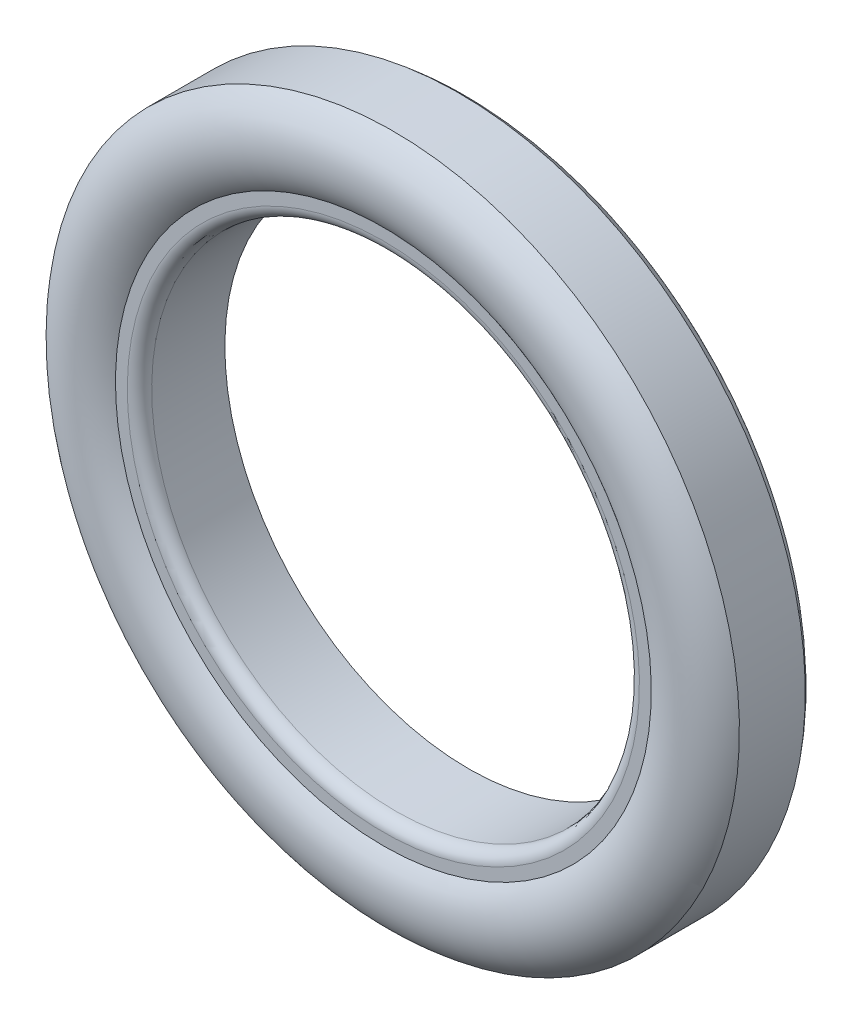
ISO-10303-21;
HEADER;
FILE_DESCRIPTION(('STEP AP214'),'2;1');
FILE_NAME('part.step','',(''),(''),'','','');
FILE_SCHEMA(('AUTOMOTIVE_DESIGN { 1 0 10303 214 1 1 1 1 }'));
ENDSEC;
DATA;
#1=APPLICATION_CONTEXT('core data for automotive mechanical design processes');
#2=APPLICATION_PROTOCOL_DEFINITION('international standard','automotive_design',2000,#1);
#3=PRODUCT_CONTEXT('',#1,'mechanical');
#4=PRODUCT('Part','Part','',(#3));
#5=PRODUCT_RELATED_PRODUCT_CATEGORY('part','',(#4));
#6=PRODUCT_DEFINITION_FORMATION('','',#4);
#7=PRODUCT_DEFINITION_CONTEXT('part definition',#1,'design');
#8=PRODUCT_DEFINITION('design','',#6,#7);
#9=PRODUCT_DEFINITION_SHAPE('','',#8);
#10=(LENGTH_UNIT() NAMED_UNIT(*) SI_UNIT(.MILLI.,.METRE.));
#11=(NAMED_UNIT(*) PLANE_ANGLE_UNIT() SI_UNIT($,.RADIAN.));
#12=(NAMED_UNIT(*) SI_UNIT($,.STERADIAN.) SOLID_ANGLE_UNIT());
#13=UNCERTAINTY_MEASURE_WITH_UNIT(LENGTH_MEASURE(1.E-05),#10,'distance_accuracy_value','');
#14=(GEOMETRIC_REPRESENTATION_CONTEXT(3) GLOBAL_UNCERTAINTY_ASSIGNED_CONTEXT((#13)) GLOBAL_UNIT_ASSIGNED_CONTEXT((#10,
#11,#12)) REPRESENTATION_CONTEXT('',''));
#15=CARTESIAN_POINT('',(0.,0.,0.));
#16=DIRECTION('',(0.,0.,1.));
#17=DIRECTION('',(1.,0.,0.));
#18=AXIS2_PLACEMENT_3D('',#15,#16,#17);
#19=CARTESIAN_POINT('',(0.108004329328892,-0.0375670954749011,-81.4999909937421));
#20=DIRECTION('',(-1.19875711474387E-13,0.,1.));
#21=DIRECTION('',(0.10773497427185,-0.994179649418878,0.));
#22=AXIS2_PLACEMENT_3D('',#19,#20,#21);
#23=PLANE('',#22);
#24=CARTESIAN_POINT('',(0.108004329328892,-0.0375670954749011,-81.4999909937421));
#25=DIRECTION('',(1.19875711474387E-13,0.,-1.));
#26=DIRECTION('',(-0.994179649418878,-0.10773497427185,-1.29429069442816E-13));
#27=AXIS2_PLACEMENT_3D('',#24,#25,#26);
#28=CIRCLE('',#27,219.715728752538);
#29=CARTESIAN_POINT('',(218.544910512342,23.6335012888007,-81.4999909937136));
#30=VERTEX_POINT('',#29);
#31=EDGE_CURVE('E11',#30,#30,#28,.T.);
#32=ORIENTED_EDGE('',*,*,#31,.T.);
#33=EDGE_LOOP('',(#32));
#34=FACE_BOUND('',#33,.T.);
#35=CARTESIAN_POINT('',(0.108004329328846,-0.0375670954749018,-81.4999909937421));
#36=DIRECTION('',(1.19875711474387E-13,0.,-1.));
#37=DIRECTION('',(-0.994179649418878,-0.10773497427185,-1.29429069442816E-13));
#38=AXIS2_PLACEMENT_3D('',#35,#36,#37);
#39=CIRCLE('',#38,200.);
#40=CARTESIAN_POINT('',(-197.636067245188,-29.9922354650696,-81.4999909937686));
#41=VERTEX_POINT('',#40);
#42=EDGE_CURVE('E28',#41,#41,#39,.T.);
#43=ORIENTED_EDGE('',*,*,#42,.F.);
#44=EDGE_LOOP('',(#43));
#45=FACE_BOUND('',#44,.T.);
#46=ADVANCED_FACE('F17',(#34,#45),#23,.F.);
#47=CARTESIAN_POINT('',(0.108004329320455,-0.0375670954815624,-11.4999909937421));
#48=DIRECTION('',(-1.19875711474387E-13,0.,1.));
#49=DIRECTION('',(-0.994179649418878,-0.10773497427185,-1.29429069442816E-13));
#50=AXIS2_PLACEMENT_3D('',#47,#48,#49);
#51=CYLINDRICAL_SURFACE('',#50,200.);
#52=ORIENTED_EDGE('',*,*,#42,.T.);
#53=EDGE_LOOP('',(#52));
#54=FACE_BOUND('',#53,.T.);
#55=CARTESIAN_POINT('',(0.108004329321787,-0.0375670954806118,-21.4999909937421));
#56=DIRECTION('',(1.19875711474387E-13,0.,-1.));
#57=DIRECTION('',(-0.994179649418878,-0.10773497427185,-1.29429069442816E-13));
#58=AXIS2_PLACEMENT_3D('',#55,#56,#57);
#59=CIRCLE('',#58,200.);
#60=CARTESIAN_POINT('',(198.943934213097,21.5094277588893,-21.4999909937162));
#61=VERTEX_POINT('',#60);
#62=EDGE_CURVE('E58',#61,#61,#59,.T.);
#63=ORIENTED_EDGE('',*,*,#62,.F.);
#64=EDGE_LOOP('',(#63));
#65=FACE_BOUND('',#64,.T.);
#66=ADVANCED_FACE('F59',(#54,#65),#51,.F.);
#67=CARTESIAN_POINT('',(0.108004329321787,-0.0375670954806118,-21.4999909937421));
#68=DIRECTION('',(1.19875711474387E-13,0.,-1.));
#69=DIRECTION('',(-0.994179649418878,-0.10773497427185,-1.29429069442816E-13));
#70=AXIS2_PLACEMENT_3D('',#67,#68,#69);
#71=TOROIDAL_SURFACE('',#70,210.,10.);
#72=CARTESIAN_POINT('',(0.108004329320455,-0.0375670954815624,-11.4999909937421));
#73=DIRECTION('',(-1.19875711474387E-13,0.,1.));
#74=DIRECTION('',(-0.994179649418878,-0.10773497427185,-1.29429069442816E-13));
#75=AXIS2_PLACEMENT_3D('',#72,#73,#74);
#76=CIRCLE('',#75,210.);
#77=CARTESIAN_POINT('',(208.885730707285,22.5867775016069,-11.499990993715));
#78=VERTEX_POINT('',#77);
#79=EDGE_CURVE('E21',#78,#78,#76,.T.);
#80=ORIENTED_EDGE('',*,*,#79,.T.);
#81=EDGE_LOOP('',(#80));
#82=FACE_BOUND('',#81,.T.);
#83=ORIENTED_EDGE('',*,*,#62,.T.);
#84=EDGE_LOOP('',(#83));
#85=FACE_BOUND('',#84,.T.);
#86=ADVANCED_FACE('F19',(#82,#85),#71,.T.);
#87=CARTESIAN_POINT('',(0.108004329324451,-0.0375670954782317,-46.4999909937421));
#88=DIRECTION('',(1.19875711474387E-13,0.,-1.));
#89=DIRECTION('',(-0.994179649418878,-0.10773497427185,-1.29429069442816E-13));
#90=AXIS2_PLACEMENT_3D('',#87,#88,#89);
#91=TOROIDAL_SURFACE('',#90,248.,45.);
#92=ORIENTED_EDGE('',*,*,#31,.F.);
#93=EDGE_LOOP('',(#92));
#94=FACE_BOUND('',#93,.T.);
#95=CARTESIAN_POINT('',(0.108004329328004,-0.0375670954756574,-73.499990993742));
#96=DIRECTION('',(1.19849381427703E-13,0.,-1.));
#97=DIRECTION('',(-0.990832912136203,-0.13509307986604,-1.31604550370782E-13));
#98=AXIS2_PLACEMENT_3D('',#95,#96,#97);
#99=CIRCLE('',#98,284.);
#100=CARTESIAN_POINT('',(-281.288542717354,-38.404001777431,-73.4999909937793));
#101=VERTEX_POINT('',#100);
#102=EDGE_CURVE('E62',#101,#101,#99,.T.);
#103=ORIENTED_EDGE('',*,*,#102,.T.);
#104=EDGE_LOOP('',(#103));
#105=FACE_BOUND('',#104,.T.);
#106=ADVANCED_FACE('F100',(#94,#105),#91,.T.);
#107=CARTESIAN_POINT('',(0.108004329324451,-0.0375670954782317,-46.4999909937421));
#108=DIRECTION('',(1.19875711474387E-13,0.,-1.));
#109=DIRECTION('',(-0.994179649418878,-0.10773497427185,-1.29429069442816E-13));
#110=AXIS2_PLACEMENT_3D('',#107,#108,#109);
#111=TOROIDAL_SURFACE('',#110,248.,45.);
#112=CARTESIAN_POINT('',(0.108004329321343,-0.0375670954807991,-19.4999909937421));
#113=DIRECTION('',(-1.19849381427703E-13,0.,1.));
#114=DIRECTION('',(-0.990832912136203,-0.13509307986604,-1.31604550370782E-13));
#115=AXIS2_PLACEMENT_3D('',#112,#113,#114);
#116=CIRCLE('',#115,284.);
#117=CARTESIAN_POINT('',(-281.28854271736,-38.4040017774361,-19.4999909937795));
#118=VERTEX_POINT('',#117);
#119=EDGE_CURVE('E71',#118,#118,#116,.T.);
#120=ORIENTED_EDGE('',*,*,#119,.T.);
#121=EDGE_LOOP('',(#120));
#122=FACE_BOUND('',#121,.T.);
#123=CARTESIAN_POINT('',(0.108004329320455,-0.0375670954815624,-11.4999909937421));
#124=DIRECTION('',(-1.19875711474387E-13,0.,1.));
#125=DIRECTION('',(0.994179649418878,0.10773497427185,1.29429069442816E-13));
#126=AXIS2_PLACEMENT_3D('',#123,#124,#125);
#127=CIRCLE('',#126,219.715728752538);
#128=CARTESIAN_POINT('',(218.544910512334,23.633501288794,-11.4999909937137));
#129=VERTEX_POINT('',#128);
#130=EDGE_CURVE('E76',#129,#129,#127,.T.);
#131=ORIENTED_EDGE('',*,*,#130,.F.);
#132=EDGE_LOOP('',(#131));
#133=FACE_BOUND('',#132,.T.);
#134=ADVANCED_FACE('F103',(#122,#133),#111,.T.);
#135=CARTESIAN_POINT('',(0.108004329328892,-0.0375670954749011,-81.4999909937421));
#136=DIRECTION('',(-1.19849381427703E-13,0.,1.));
#137=DIRECTION('',(-0.990832912136203,-0.13509307986604,-1.31604550370782E-13));
#138=AXIS2_PLACEMENT_3D('',#135,#136,#137);
#139=CYLINDRICAL_SURFACE('',#138,284.);
#140=ORIENTED_EDGE('',*,*,#102,.F.);
#141=EDGE_LOOP('',(#140));
#142=FACE_BOUND('',#141,.T.);
#143=ORIENTED_EDGE('',*,*,#119,.F.);
#144=EDGE_LOOP('',(#143));
#145=FACE_BOUND('',#144,.T.);
#146=ADVANCED_FACE('F97',(#142,#145),#139,.T.);
#147=CARTESIAN_POINT('',(-809.759233321686,177.746170573428,-11.4999909938223));
#148=DIRECTION('',(1.19875711474387E-13,0.,-1.));
#149=DIRECTION('',(-0.994179649418878,-0.10773497427185,-1.29429069442816E-13));
#150=AXIS2_PLACEMENT_3D('',#147,#148,#149);
#151=PLANE('',#150);
#152=ORIENTED_EDGE('',*,*,#130,.T.);
#153=EDGE_LOOP('',(#152));
#154=FACE_BOUND('',#153,.T.);
#155=ORIENTED_EDGE('',*,*,#79,.F.);
#156=EDGE_LOOP('',(#155));
#157=FACE_BOUND('',#156,.T.);
#158=ADVANCED_FACE('F95',(#154,#157),#151,.F.);
#159=CLOSED_SHELL('',(#46,#66,#86,#106,#134,#146,#158));
#160=MANIFOLD_SOLID_BREP('B1',#159);
#161=ADVANCED_BREP_SHAPE_REPRESENTATION('',(#18,#160),#14);
#162=SHAPE_DEFINITION_REPRESENTATION(#9,#161);
ENDSEC;
END-ISO-10303-21;
